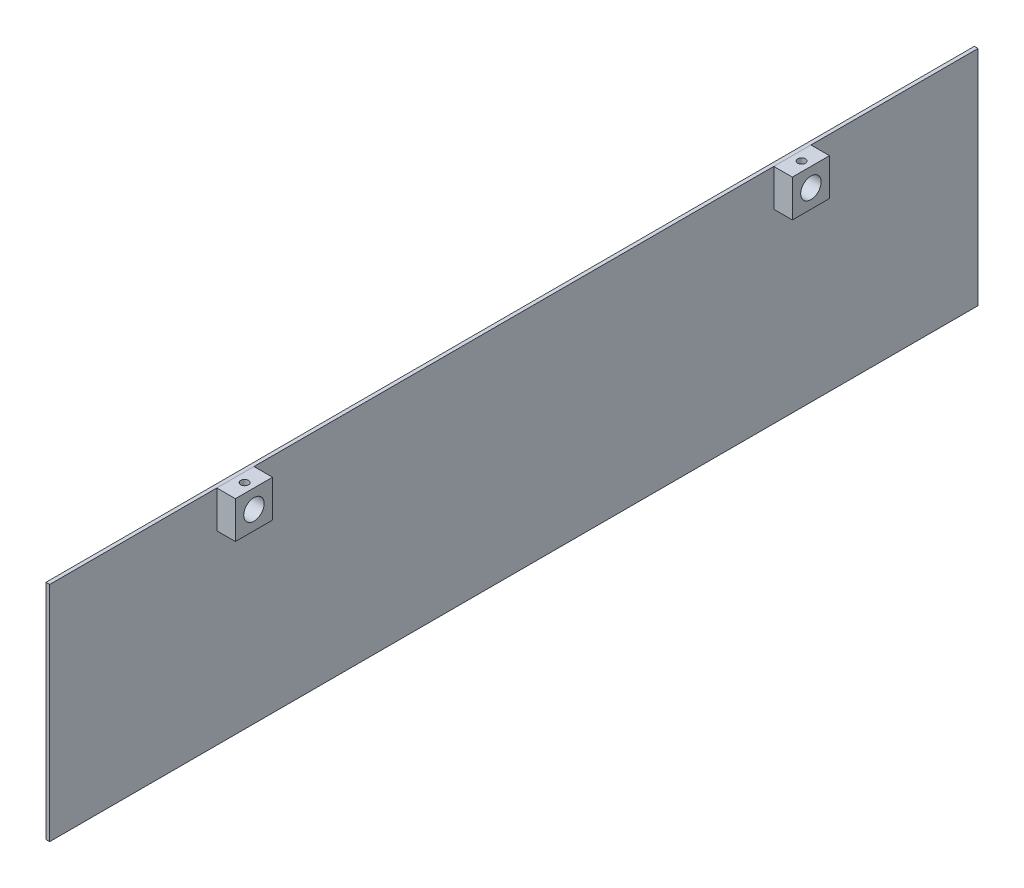
ISO-10303-21;
HEADER;
FILE_DESCRIPTION(('STEP AP214'),'2;1');
FILE_NAME('part.step','',(''),(''),'','','');
FILE_SCHEMA(('AUTOMOTIVE_DESIGN { 1 0 10303 214 1 1 1 1 }'));
ENDSEC;
DATA;
#1=APPLICATION_CONTEXT('core data for automotive mechanical design processes');
#2=APPLICATION_PROTOCOL_DEFINITION('international standard','automotive_design',2000,#1);
#3=PRODUCT_CONTEXT('',#1,'mechanical');
#4=PRODUCT('Part','Part','',(#3));
#5=PRODUCT_RELATED_PRODUCT_CATEGORY('part','',(#4));
#6=PRODUCT_DEFINITION_FORMATION('','',#4);
#7=PRODUCT_DEFINITION_CONTEXT('part definition',#1,'design');
#8=PRODUCT_DEFINITION('design','',#6,#7);
#9=PRODUCT_DEFINITION_SHAPE('','',#8);
#10=(LENGTH_UNIT() NAMED_UNIT(*) SI_UNIT(.MILLI.,.METRE.));
#11=(NAMED_UNIT(*) PLANE_ANGLE_UNIT() SI_UNIT($,.RADIAN.));
#12=(NAMED_UNIT(*) SI_UNIT($,.STERADIAN.) SOLID_ANGLE_UNIT());
#13=UNCERTAINTY_MEASURE_WITH_UNIT(LENGTH_MEASURE(1.E-05),#10,'distance_accuracy_value','');
#14=(GEOMETRIC_REPRESENTATION_CONTEXT(3) GLOBAL_UNCERTAINTY_ASSIGNED_CONTEXT((#13)) GLOBAL_UNIT_ASSIGNED_CONTEXT((#10,
#11,#12)) REPRESENTATION_CONTEXT('',''));
#15=CARTESIAN_POINT('',(0.,0.,0.));
#16=DIRECTION('',(0.,0.,1.));
#17=DIRECTION('',(1.,0.,0.));
#18=AXIS2_PLACEMENT_3D('',#15,#16,#17);
#19=CARTESIAN_POINT('',(12.,120.,-140.));
#20=DIRECTION('',(0.,0.,-1.));
#21=DIRECTION('',(-1.,0.,0.));
#22=AXIS2_PLACEMENT_3D('',#19,#20,#21);
#23=PLANE('',#22);
#24=DIRECTION('',(0.,-1.,0.));
#25=VECTOR('',#24,1.);
#26=CARTESIAN_POINT('',(2.,120.,-140.));
#27=LINE('',#26,#25);
#28=CARTESIAN_POINT('',(2.,120.,-140.));
#29=VERTEX_POINT('',#28);
#30=CARTESIAN_POINT('',(2.,100.,-140.));
#31=VERTEX_POINT('',#30);
#32=EDGE_CURVE('E127',#29,#31,#27,.T.);
#33=ORIENTED_EDGE('',*,*,#32,.T.);
#34=DIRECTION('',(-1.,0.,0.));
#35=VECTOR('',#34,1.);
#36=CARTESIAN_POINT('',(12.,100.,-140.));
#37=LINE('',#36,#35);
#38=CARTESIAN_POINT('',(12.,100.,-140.));
#39=VERTEX_POINT('',#38);
#40=EDGE_CURVE('E12',#39,#31,#37,.T.);
#41=ORIENTED_EDGE('',*,*,#40,.F.);
#42=DIRECTION('',(0.,-1.,0.));
#43=VECTOR('',#42,1.);
#44=CARTESIAN_POINT('',(12.,120.,-140.));
#45=LINE('',#44,#43);
#46=CARTESIAN_POINT('',(12.,120.,-140.));
#47=VERTEX_POINT('',#46);
#48=EDGE_CURVE('E114',#47,#39,#45,.T.);
#49=ORIENTED_EDGE('',*,*,#48,.F.);
#50=DIRECTION('',(-1.,0.,0.));
#51=VECTOR('',#50,1.);
#52=CARTESIAN_POINT('',(12.,120.,-140.));
#53=LINE('',#52,#51);
#54=EDGE_CURVE('E123',#47,#29,#53,.T.);
#55=ORIENTED_EDGE('',*,*,#54,.T.);
#56=EDGE_LOOP('',(#33,#41,#49,#55));
#57=FACE_BOUND('',#56,.T.);
#58=ADVANCED_FACE('F57',(#57),#23,.F.);
#59=CARTESIAN_POINT('',(12.,100.,-140.));
#60=DIRECTION('',(0.,1.,0.));
#61=DIRECTION('',(0.,0.,1.));
#62=AXIS2_PLACEMENT_3D('',#59,#60,#61);
#63=PLANE('',#62);
#64=DIRECTION('',(0.,0.,-1.));
#65=VECTOR('',#64,1.);
#66=CARTESIAN_POINT('',(2.,100.,-140.));
#67=LINE('',#66,#65);
#68=CARTESIAN_POINT('',(2.,100.,-160.));
#69=VERTEX_POINT('',#68);
#70=EDGE_CURVE('E118',#31,#69,#67,.T.);
#71=ORIENTED_EDGE('',*,*,#70,.T.);
#72=DIRECTION('',(-1.,0.,0.));
#73=VECTOR('',#72,1.);
#74=CARTESIAN_POINT('',(12.,100.,-160.));
#75=LINE('',#74,#73);
#76=CARTESIAN_POINT('',(12.,100.,-160.));
#77=VERTEX_POINT('',#76);
#78=EDGE_CURVE('E70',#77,#69,#75,.T.);
#79=ORIENTED_EDGE('',*,*,#78,.F.);
#80=DIRECTION('',(0.,0.,-1.));
#81=VECTOR('',#80,1.);
#82=CARTESIAN_POINT('',(12.,100.,-140.));
#83=LINE('',#82,#81);
#84=EDGE_CURVE('E109',#39,#77,#83,.T.);
#85=ORIENTED_EDGE('',*,*,#84,.F.);
#86=ORIENTED_EDGE('',*,*,#40,.T.);
#87=EDGE_LOOP('',(#71,#79,#85,#86));
#88=FACE_BOUND('',#87,.T.);
#89=ADVANCED_FACE('F117',(#88),#63,.F.);
#90=CARTESIAN_POINT('',(12.,120.,-160.));
#91=DIRECTION('',(0.,0.,1.));
#92=DIRECTION('',(0.,-1.,0.));
#93=AXIS2_PLACEMENT_3D('',#90,#91,#92);
#94=PLANE('',#93);
#95=DIRECTION('',(0.,1.,0.));
#96=VECTOR('',#95,1.);
#97=CARTESIAN_POINT('',(2.,120.,-160.));
#98=LINE('',#97,#96);
#99=CARTESIAN_POINT('',(2.,120.,-160.));
#100=VERTEX_POINT('',#99);
#101=EDGE_CURVE('E96',#69,#100,#98,.T.);
#102=ORIENTED_EDGE('',*,*,#101,.T.);
#103=DIRECTION('',(-1.,0.,0.));
#104=VECTOR('',#103,1.);
#105=CARTESIAN_POINT('',(12.,120.,-160.));
#106=LINE('',#105,#104);
#107=CARTESIAN_POINT('',(12.,120.,-160.));
#108=VERTEX_POINT('',#107);
#109=EDGE_CURVE('E119',#108,#100,#106,.T.);
#110=ORIENTED_EDGE('',*,*,#109,.F.);
#111=DIRECTION('',(0.,1.,0.));
#112=VECTOR('',#111,1.);
#113=CARTESIAN_POINT('',(12.,120.,-160.));
#114=LINE('',#113,#112);
#115=EDGE_CURVE('E112',#77,#108,#114,.T.);
#116=ORIENTED_EDGE('',*,*,#115,.F.);
#117=ORIENTED_EDGE('',*,*,#78,.T.);
#118=EDGE_LOOP('',(#102,#110,#116,#117));
#119=FACE_BOUND('',#118,.T.);
#120=ADVANCED_FACE('F121',(#119),#94,.F.);
#121=CARTESIAN_POINT('',(12.,120.,-140.));
#122=DIRECTION('',(0.,-1.,0.));
#123=DIRECTION('',(0.,0.,-1.));
#124=AXIS2_PLACEMENT_3D('',#121,#122,#123);
#125=PLANE('',#124);
#126=CARTESIAN_POINT('',(7.,120.,-150.));
#127=DIRECTION('',(0.,1.,0.));
#128=DIRECTION('',(0.,0.,1.));
#129=AXIS2_PLACEMENT_3D('',#126,#127,#128);
#130=CIRCLE('',#129,2.1);
#131=CARTESIAN_POINT('',(7.,120.,-147.9));
#132=VERTEX_POINT('',#131);
#133=EDGE_CURVE('E142',#132,#132,#130,.T.);
#134=ORIENTED_EDGE('',*,*,#133,.F.);
#135=EDGE_LOOP('',(#134));
#136=FACE_BOUND('',#135,.T.);
#137=DIRECTION('',(0.,0.,1.));
#138=VECTOR('',#137,1.);
#139=CARTESIAN_POINT('',(2.,120.,-140.));
#140=LINE('',#139,#138);
#141=EDGE_CURVE('E102',#100,#29,#140,.T.);
#142=ORIENTED_EDGE('',*,*,#141,.T.);
#143=ORIENTED_EDGE('',*,*,#54,.F.);
#144=DIRECTION('',(0.,0.,1.));
#145=VECTOR('',#144,1.);
#146=CARTESIAN_POINT('',(12.,120.,-140.));
#147=LINE('',#146,#145);
#148=EDGE_CURVE('E79',#108,#47,#147,.T.);
#149=ORIENTED_EDGE('',*,*,#148,.F.);
#150=ORIENTED_EDGE('',*,*,#109,.T.);
#151=EDGE_LOOP('',(#142,#143,#149,#150));
#152=FACE_BOUND('',#151,.T.);
#153=ADVANCED_FACE('F152',(#136,#152),#125,.F.);
#154=CARTESIAN_POINT('',(12.,0.,0.));
#155=DIRECTION('',(1.,0.,0.));
#156=DIRECTION('',(0.,0.,-1.));
#157=AXIS2_PLACEMENT_3D('',#154,#155,#156);
#158=PLANE('',#157);
#159=CARTESIAN_POINT('',(12.,110.,-150.));
#160=DIRECTION('',(1.,0.,0.));
#161=DIRECTION('',(0.,0.,-1.));
#162=AXIS2_PLACEMENT_3D('',#159,#160,#161);
#163=CIRCLE('',#162,5.5);
#164=CARTESIAN_POINT('',(12.,110.,-155.5));
#165=VERTEX_POINT('',#164);
#166=EDGE_CURVE('E130',#165,#165,#163,.T.);
#167=ORIENTED_EDGE('',*,*,#166,.F.);
#168=EDGE_LOOP('',(#167));
#169=FACE_BOUND('',#168,.T.);
#170=ORIENTED_EDGE('',*,*,#48,.T.);
#171=ORIENTED_EDGE('',*,*,#84,.T.);
#172=ORIENTED_EDGE('',*,*,#115,.T.);
#173=ORIENTED_EDGE('',*,*,#148,.T.);
#174=EDGE_LOOP('',(#170,#171,#172,#173));
#175=FACE_BOUND('',#174,.T.);
#176=ADVANCED_FACE('F110',(#169,#175),#158,.T.);
#177=CARTESIAN_POINT('',(2.,0.,0.));
#178=DIRECTION('',(1.,0.,0.));
#179=DIRECTION('',(0.,0.,-1.));
#180=AXIS2_PLACEMENT_3D('',#177,#178,#179);
#181=PLANE('',#180);
#182=CARTESIAN_POINT('',(2.,110.,-150.));
#183=DIRECTION('',(1.,0.,0.));
#184=DIRECTION('',(0.,0.,-1.));
#185=AXIS2_PLACEMENT_3D('',#182,#183,#184);
#186=CIRCLE('',#185,5.5);
#187=CARTESIAN_POINT('',(2.,110.,-155.5));
#188=VERTEX_POINT('',#187);
#189=EDGE_CURVE('E135',#188,#188,#186,.T.);
#190=ORIENTED_EDGE('',*,*,#189,.T.);
#191=EDGE_LOOP('',(#190));
#192=FACE_BOUND('',#191,.T.);
#193=ORIENTED_EDGE('',*,*,#32,.F.);
#194=ORIENTED_EDGE('',*,*,#141,.F.);
#195=ORIENTED_EDGE('',*,*,#101,.F.);
#196=ORIENTED_EDGE('',*,*,#70,.F.);
#197=EDGE_LOOP('',(#193,#194,#195,#196));
#198=FACE_BOUND('',#197,.T.);
#199=ADVANCED_FACE('F159',(#192,#198),#181,.F.);
#200=CARTESIAN_POINT('',(0.,110.,-150.));
#201=DIRECTION('',(-1.,0.,0.));
#202=DIRECTION('',(0.,0.,1.));
#203=AXIS2_PLACEMENT_3D('',#200,#201,#202);
#204=CYLINDRICAL_SURFACE('',#203,5.5);
#205=CARTESIAN_POINT('',(7.,115.083306010856,-147.9));
#206=CARTESIAN_POINT('',(7.11323924599918,115.083301214416,-147.899994963913));
#207=CARTESIAN_POINT('',(7.22644605213108,115.087130898249,-147.909189696473));
#208=CARTESIAN_POINT('',(7.44943658790395,115.101922901937,-147.945550039406));
#209=CARTESIAN_POINT('',(7.55922051538683,115.112884808746,-147.9727146091));
#210=CARTESIAN_POINT('',(7.77207893179357,115.140522346164,-148.043864523318));
#211=CARTESIAN_POINT('',(7.87516929596382,115.157183822516,-148.087808229811));
#212=CARTESIAN_POINT('',(8.07255518360995,115.194319963944,-148.191120774258));
#213=CARTESIAN_POINT('',(8.16684795283485,115.214795817211,-148.250494420967));
#214=CARTESIAN_POINT('',(8.34882472708949,115.258436332225,-148.386260425491));
#215=CARTESIAN_POINT('',(8.43599136604027,115.281682060583,-148.463320367709));
#216=CARTESIAN_POINT('',(8.59653100997823,115.327568240787,-148.630856506143));
#217=CARTESIAN_POINT('',(8.6699009319702,115.350208556382,-148.721335692945));
#218=CARTESIAN_POINT('',(8.80328257446287,115.393301030513,-148.917094322527));
#219=CARTESIAN_POINT('',(8.86272835792435,115.413647129005,-149.022784812363));
#220=CARTESIAN_POINT('',(8.96277975012171,115.44888076722,-149.243580933959));
#221=CARTESIAN_POINT('',(9.00339215188897,115.463770274681,-149.358683153342));
#222=CARTESIAN_POINT('',(9.06279869448369,115.485837321835,-149.58959372244));
#223=CARTESIAN_POINT('',(9.08248432648559,115.493328910443,-149.70514211546));
#224=CARTESIAN_POINT('',(9.10233879614522,115.500885230288,-149.938129080697));
#225=CARTESIAN_POINT('',(9.10251421313418,115.500952465202,-150.055567002356));
#226=CARTESIAN_POINT('',(9.08385428477466,115.493849943725,-150.282595169799));
#227=CARTESIAN_POINT('',(9.06599295987754,115.487050974919,-150.392279111296));
#228=CARTESIAN_POINT('',(9.01340990239304,115.467469905258,-150.606956740662));
#229=CARTESIAN_POINT('',(8.97868697134,115.454687379112,-150.711950094561));
#230=CARTESIAN_POINT('',(8.89293296293302,115.424165535434,-150.916104523423));
#231=CARTESIAN_POINT('',(8.84166934367598,115.406356020723,-151.015156991787));
#232=CARTESIAN_POINT('',(8.72449800700278,115.367573140765,-151.203502611));
#233=CARTESIAN_POINT('',(8.65858547470169,115.346598735995,-151.292792538613));
#234=CARTESIAN_POINT('',(8.50933386494868,115.302142796285,-151.464802690471));
#235=CARTESIAN_POINT('',(8.42518228152462,115.278586349834,-151.546799622912));
#236=CARTESIAN_POINT('',(8.24419413020365,115.232625304142,-151.69579649357));
#237=CARTESIAN_POINT('',(8.14735414266442,115.210221017693,-151.762792375632));
#238=CARTESIAN_POINT('',(7.94078351559792,115.168618719592,-151.881338321953));
#239=CARTESIAN_POINT('',(7.83080138896254,115.149509472714,-151.932483852695));
#240=CARTESIAN_POINT('',(7.60286263095197,115.117690363236,-152.015250624193));
#241=CARTESIAN_POINT('',(7.4849106777992,115.104976782818,-152.046883210298));
#242=CARTESIAN_POINT('',(7.2515480532962,115.088272204495,-152.088050444268));
#243=CARTESIAN_POINT('',(7.13637365549402,115.083826729326,-152.098738332001));
#244=CARTESIAN_POINT('',(6.90581649510366,115.082872833562,-152.101049757352));
#245=CARTESIAN_POINT('',(6.79043379538704,115.086362322728,-152.092678315604));
#246=CARTESIAN_POINT('',(6.56877806112669,115.100422278701,-152.05815560956));
#247=CARTESIAN_POINT('',(6.46233782787644,115.110630501482,-152.032912940549));
#248=CARTESIAN_POINT('',(6.25525796839143,115.136542794095,-151.966516951426));
#249=CARTESIAN_POINT('',(6.154619561944,115.152248014754,-151.925360299443));
#250=CARTESIAN_POINT('',(5.957703840292,115.188124733232,-151.826531819896));
#251=CARTESIAN_POINT('',(5.86174188841835,115.20844444292,-151.768287050022));
#252=CARTESIAN_POINT('',(5.68054562227894,115.251017812303,-151.637538742146));
#253=CARTESIAN_POINT('',(5.59531537706469,115.27327220018,-151.565029822267));
#254=CARTESIAN_POINT('',(5.43215020452321,115.318986043928,-151.402139349036));
#255=CARTESIAN_POINT('',(5.35507081079171,115.34242783418,-151.310892808975));
#256=CARTESIAN_POINT('',(5.21720747685611,115.38647127696,-151.116188537561));
#257=CARTESIAN_POINT('',(5.15642373793007,115.407072894405,-151.012730655402));
#258=CARTESIAN_POINT('',(5.05323583817392,115.443119756007,-150.796501119386));
#259=CARTESIAN_POINT('',(5.01078265537107,115.45857872753,-150.683755279548));
#260=CARTESIAN_POINT('',(4.94569506813486,115.482631096604,-150.451994523788));
#261=CARTESIAN_POINT('',(4.92305096403179,115.49122785411,-150.33298270635));
#262=CARTESIAN_POINT('',(4.89929867972616,115.500258003107,-150.099786932427));
#263=CARTESIAN_POINT('',(4.89697663886882,115.50115147004,-149.985743370233));
#264=CARTESIAN_POINT('',(4.91078978317764,115.495885511465,-149.758957532749));
#265=CARTESIAN_POINT('',(4.92692260212128,115.489726990141,-149.646215092506));
#266=CARTESIAN_POINT('',(4.97633015625743,115.471264623559,-149.428220066486));
#267=CARTESIAN_POINT('',(5.00914781709263,115.459124892033,-149.322848915137));
#268=CARTESIAN_POINT('',(5.09053185625519,115.429975100761,-149.119107005863));
#269=CARTESIAN_POINT('',(5.13910121739089,115.412964118645,-149.020737578118));
#270=CARTESIAN_POINT('',(5.25296397987995,115.374861839354,-148.829186079211));
#271=CARTESIAN_POINT('',(5.31888300551865,115.353627315351,-148.736404933105));
#272=CARTESIAN_POINT('',(5.46459990279232,115.309673402757,-148.562851131284));
#273=CARTESIAN_POINT('',(5.54440279732914,115.286953478642,-148.482082841258));
#274=CARTESIAN_POINT('',(5.72085289950583,115.241047613535,-148.330251565274));
#275=CARTESIAN_POINT('',(5.81818662582507,115.217905145217,-148.259970127119));
#276=CARTESIAN_POINT('',(6.02401025807751,115.175174970982,-148.13671393994));
#277=CARTESIAN_POINT('',(6.13250212204522,115.15558789064,-148.083742235271));
#278=CARTESIAN_POINT('',(6.36457399080009,115.121510010511,-147.994361592728));
#279=CARTESIAN_POINT('',(6.48866796593674,115.107392862766,-147.95912899804));
#280=CARTESIAN_POINT('',(6.74185782249741,115.088296936256,-147.911959586557));
#281=CARTESIAN_POINT('',(6.87094997672628,115.083311476987,-147.900005739239));
#282=CARTESIAN_POINT('',(7.,115.083306010856,-147.9));
#283=B_SPLINE_CURVE_WITH_KNOTS('',3,(#205,#206,#207,#208,#209,#210,#211,#212,#213,#214,#215,
#216,#217,#218,#219,#220,#221,#222,#223,#224,#225,#226,#227,#228,#229,#230,#231,#232,#233,#234,
#235,#236,#237,#238,#239,#240,#241,#242,#243,#244,#245,#246,#247,#248,#249,#250,#251,#252,#253,
#254,#255,#256,#257,#258,#259,#260,#261,#262,#263,#264,#265,#266,#267,#268,#269,#270,#271,#272,
#273,#274,#275,#276,#277,#278,#279,#280,#281,#282),.UNSPECIFIED.,.T.,.F.,(4,2,2,2,2,2,2,2,2,2,2,
2,2,2,2,2,2,2,2,2,2,2,2,2,2,2,2,2,2,2,2,2,2,2,2,2,2,2,4),(0.,0.339236745329205,
0.678453846334541,1.01683458183301,1.35532090073262,1.70968239708651,2.06412298471311,
2.43113201692697,2.79800856912394,3.14853893275951,3.49895108845312,3.83140130712534,
4.16387515868885,4.50124323629779,4.83872236632005,5.19659957847019,5.55457344100136,
5.92104736634925,6.28730801259865,6.63276245548056,6.97812590884218,7.30624576014903,
7.63443434630403,7.97521179849022,8.31611807380053,8.67957522382824,9.04303686294126,
9.40552037257612,9.76782628982698,10.1083317692312,10.4487935950156,10.7803943485643,
11.1120579321294,11.457885233258,11.8038379088439,12.1688817993161,12.5339898574897,
12.9208749252753,13.3074768448991),.UNSPECIFIED.);
#284=CARTESIAN_POINT('',(7.,115.083306010856,-147.9));
#285=VERTEX_POINT('',#284);
#286=EDGE_CURVE('E60',#285,#285,#283,.T.);
#287=ORIENTED_EDGE('',*,*,#286,.T.);
#288=EDGE_LOOP('',(#287));
#289=FACE_BOUND('',#288,.T.);
#290=ORIENTED_EDGE('',*,*,#166,.T.);
#291=EDGE_LOOP('',(#290));
#292=FACE_BOUND('',#291,.T.);
#293=ORIENTED_EDGE('',*,*,#189,.F.);
#294=EDGE_LOOP('',(#293));
#295=FACE_BOUND('',#294,.T.);
#296=ADVANCED_FACE('F172',(#289,#292,#295),#204,.F.);
#297=CARTESIAN_POINT('',(7.,120.,-150.));
#298=DIRECTION('',(0.,1.,0.));
#299=DIRECTION('',(0.,0.,1.));
#300=AXIS2_PLACEMENT_3D('',#297,#298,#299);
#301=CYLINDRICAL_SURFACE('',#300,2.1);
#302=ORIENTED_EDGE('',*,*,#133,.T.);
#303=EDGE_LOOP('',(#302));
#304=FACE_BOUND('',#303,.T.);
#305=ORIENTED_EDGE('',*,*,#286,.F.);
#306=EDGE_LOOP('',(#305));
#307=FACE_BOUND('',#306,.T.);
#308=ADVANCED_FACE('F149',(#304,#307),#301,.F.);
#309=CLOSED_SHELL('',(#58,#89,#120,#153,#176,#199,#296,#308));
#310=MANIFOLD_SOLID_BREP('B2',#309);
#311=CARTESIAN_POINT('',(12.,120.,160.));
#312=DIRECTION('',(0.,0.,-1.));
#313=DIRECTION('',(-1.,0.,0.));
#314=AXIS2_PLACEMENT_3D('',#311,#312,#313);
#315=PLANE('',#314);
#316=DIRECTION('',(0.,-1.,0.));
#317=VECTOR('',#316,1.);
#318=CARTESIAN_POINT('',(2.,120.,160.));
#319=LINE('',#318,#317);
#320=CARTESIAN_POINT('',(2.,120.,160.));
#321=VERTEX_POINT('',#320);
#322=CARTESIAN_POINT('',(2.,100.,160.));
#323=VERTEX_POINT('',#322);
#324=EDGE_CURVE('E322',#321,#323,#319,.T.);
#325=ORIENTED_EDGE('',*,*,#324,.T.);
#326=DIRECTION('',(-1.,0.,0.));
#327=VECTOR('',#326,1.);
#328=CARTESIAN_POINT('',(12.,100.,160.));
#329=LINE('',#328,#327);
#330=CARTESIAN_POINT('',(12.,100.,160.));
#331=VERTEX_POINT('',#330);
#332=EDGE_CURVE('E55',#331,#323,#329,.T.);
#333=ORIENTED_EDGE('',*,*,#332,.F.);
#334=DIRECTION('',(0.,-1.,0.));
#335=VECTOR('',#334,1.);
#336=CARTESIAN_POINT('',(12.,120.,160.));
#337=LINE('',#336,#335);
#338=CARTESIAN_POINT('',(12.,120.,160.));
#339=VERTEX_POINT('',#338);
#340=EDGE_CURVE('E309',#339,#331,#337,.T.);
#341=ORIENTED_EDGE('',*,*,#340,.F.);
#342=DIRECTION('',(-1.,0.,0.));
#343=VECTOR('',#342,1.);
#344=CARTESIAN_POINT('',(12.,120.,160.));
#345=LINE('',#344,#343);
#346=EDGE_CURVE('E318',#339,#321,#345,.T.);
#347=ORIENTED_EDGE('',*,*,#346,.T.);
#348=EDGE_LOOP('',(#325,#333,#341,#347));
#349=FACE_BOUND('',#348,.T.);
#350=ADVANCED_FACE('F252',(#349),#315,.F.);
#351=CARTESIAN_POINT('',(12.,100.,160.));
#352=DIRECTION('',(0.,1.,0.));
#353=DIRECTION('',(0.,0.,1.));
#354=AXIS2_PLACEMENT_3D('',#351,#352,#353);
#355=PLANE('',#354);
#356=DIRECTION('',(0.,0.,-1.));
#357=VECTOR('',#356,1.);
#358=CARTESIAN_POINT('',(2.,100.,160.));
#359=LINE('',#358,#357);
#360=CARTESIAN_POINT('',(2.,100.,140.));
#361=VERTEX_POINT('',#360);
#362=EDGE_CURVE('E313',#323,#361,#359,.T.);
#363=ORIENTED_EDGE('',*,*,#362,.T.);
#364=DIRECTION('',(-1.,0.,0.));
#365=VECTOR('',#364,1.);
#366=CARTESIAN_POINT('',(12.,100.,140.));
#367=LINE('',#366,#365);
#368=CARTESIAN_POINT('',(12.,100.,140.));
#369=VERTEX_POINT('',#368);
#370=EDGE_CURVE('E265',#369,#361,#367,.T.);
#371=ORIENTED_EDGE('',*,*,#370,.F.);
#372=DIRECTION('',(0.,0.,-1.));
#373=VECTOR('',#372,1.);
#374=CARTESIAN_POINT('',(12.,100.,160.));
#375=LINE('',#374,#373);
#376=EDGE_CURVE('E304',#331,#369,#375,.T.);
#377=ORIENTED_EDGE('',*,*,#376,.F.);
#378=ORIENTED_EDGE('',*,*,#332,.T.);
#379=EDGE_LOOP('',(#363,#371,#377,#378));
#380=FACE_BOUND('',#379,.T.);
#381=ADVANCED_FACE('F312',(#380),#355,.F.);
#382=CARTESIAN_POINT('',(12.,120.,140.));
#383=DIRECTION('',(0.,0.,1.));
#384=DIRECTION('',(1.,0.,0.));
#385=AXIS2_PLACEMENT_3D('',#382,#383,#384);
#386=PLANE('',#385);
#387=DIRECTION('',(0.,1.,0.));
#388=VECTOR('',#387,1.);
#389=CARTESIAN_POINT('',(2.,120.,140.));
#390=LINE('',#389,#388);
#391=CARTESIAN_POINT('',(2.,120.,140.));
#392=VERTEX_POINT('',#391);
#393=EDGE_CURVE('E291',#361,#392,#390,.T.);
#394=ORIENTED_EDGE('',*,*,#393,.T.);
#395=DIRECTION('',(-1.,0.,0.));
#396=VECTOR('',#395,1.);
#397=CARTESIAN_POINT('',(12.,120.,140.));
#398=LINE('',#397,#396);
#399=CARTESIAN_POINT('',(12.,120.,140.));
#400=VERTEX_POINT('',#399);
#401=EDGE_CURVE('E314',#400,#392,#398,.T.);
#402=ORIENTED_EDGE('',*,*,#401,.F.);
#403=DIRECTION('',(0.,1.,0.));
#404=VECTOR('',#403,1.);
#405=CARTESIAN_POINT('',(12.,120.,140.));
#406=LINE('',#405,#404);
#407=EDGE_CURVE('E307',#369,#400,#406,.T.);
#408=ORIENTED_EDGE('',*,*,#407,.F.);
#409=ORIENTED_EDGE('',*,*,#370,.T.);
#410=EDGE_LOOP('',(#394,#402,#408,#409));
#411=FACE_BOUND('',#410,.T.);
#412=ADVANCED_FACE('F316',(#411),#386,.F.);
#413=CARTESIAN_POINT('',(12.,120.,160.));
#414=DIRECTION('',(0.,-1.,0.));
#415=DIRECTION('',(0.,0.,-1.));
#416=AXIS2_PLACEMENT_3D('',#413,#414,#415);
#417=PLANE('',#416);
#418=CARTESIAN_POINT('',(7.,120.,150.));
#419=DIRECTION('',(0.,1.,0.));
#420=DIRECTION('',(0.,0.,1.));
#421=AXIS2_PLACEMENT_3D('',#418,#419,#420);
#422=CIRCLE('',#421,2.1);
#423=CARTESIAN_POINT('',(7.,120.,152.1));
#424=VERTEX_POINT('',#423);
#425=EDGE_CURVE('E337',#424,#424,#422,.T.);
#426=ORIENTED_EDGE('',*,*,#425,.F.);
#427=EDGE_LOOP('',(#426));
#428=FACE_BOUND('',#427,.T.);
#429=DIRECTION('',(0.,0.,1.));
#430=VECTOR('',#429,1.);
#431=CARTESIAN_POINT('',(2.,120.,160.));
#432=LINE('',#431,#430);
#433=EDGE_CURVE('E297',#392,#321,#432,.T.);
#434=ORIENTED_EDGE('',*,*,#433,.T.);
#435=ORIENTED_EDGE('',*,*,#346,.F.);
#436=DIRECTION('',(0.,0.,1.));
#437=VECTOR('',#436,1.);
#438=CARTESIAN_POINT('',(12.,120.,160.));
#439=LINE('',#438,#437);
#440=EDGE_CURVE('E274',#400,#339,#439,.T.);
#441=ORIENTED_EDGE('',*,*,#440,.F.);
#442=ORIENTED_EDGE('',*,*,#401,.T.);
#443=EDGE_LOOP('',(#434,#435,#441,#442));
#444=FACE_BOUND('',#443,.T.);
#445=ADVANCED_FACE('F347',(#428,#444),#417,.F.);
#446=CARTESIAN_POINT('',(12.,0.,0.));
#447=DIRECTION('',(1.,0.,0.));
#448=DIRECTION('',(0.,0.,-1.));
#449=AXIS2_PLACEMENT_3D('',#446,#447,#448);
#450=PLANE('',#449);
#451=CARTESIAN_POINT('',(12.,110.,150.));
#452=DIRECTION('',(1.,0.,0.));
#453=DIRECTION('',(0.,0.,-1.));
#454=AXIS2_PLACEMENT_3D('',#451,#452,#453);
#455=CIRCLE('',#454,5.5);
#456=CARTESIAN_POINT('',(12.,110.,144.5));
#457=VERTEX_POINT('',#456);
#458=EDGE_CURVE('E325',#457,#457,#455,.T.);
#459=ORIENTED_EDGE('',*,*,#458,.F.);
#460=EDGE_LOOP('',(#459));
#461=FACE_BOUND('',#460,.T.);
#462=ORIENTED_EDGE('',*,*,#340,.T.);
#463=ORIENTED_EDGE('',*,*,#376,.T.);
#464=ORIENTED_EDGE('',*,*,#407,.T.);
#465=ORIENTED_EDGE('',*,*,#440,.T.);
#466=EDGE_LOOP('',(#462,#463,#464,#465));
#467=FACE_BOUND('',#466,.T.);
#468=ADVANCED_FACE('F305',(#461,#467),#450,.T.);
#469=CARTESIAN_POINT('',(2.,0.,0.));
#470=DIRECTION('',(1.,0.,0.));
#471=DIRECTION('',(0.,0.,-1.));
#472=AXIS2_PLACEMENT_3D('',#469,#470,#471);
#473=PLANE('',#472);
#474=CARTESIAN_POINT('',(2.,110.,150.));
#475=DIRECTION('',(1.,0.,0.));
#476=DIRECTION('',(0.,0.,-1.));
#477=AXIS2_PLACEMENT_3D('',#474,#475,#476);
#478=CIRCLE('',#477,5.5);
#479=CARTESIAN_POINT('',(2.,110.,144.5));
#480=VERTEX_POINT('',#479);
#481=EDGE_CURVE('E330',#480,#480,#478,.T.);
#482=ORIENTED_EDGE('',*,*,#481,.T.);
#483=EDGE_LOOP('',(#482));
#484=FACE_BOUND('',#483,.T.);
#485=ORIENTED_EDGE('',*,*,#324,.F.);
#486=ORIENTED_EDGE('',*,*,#433,.F.);
#487=ORIENTED_EDGE('',*,*,#393,.F.);
#488=ORIENTED_EDGE('',*,*,#362,.F.);
#489=EDGE_LOOP('',(#485,#486,#487,#488));
#490=FACE_BOUND('',#489,.T.);
#491=ADVANCED_FACE('F354',(#484,#490),#473,.F.);
#492=CARTESIAN_POINT('',(0.,110.,150.));
#493=DIRECTION('',(-1.,0.,0.));
#494=DIRECTION('',(0.,0.,1.));
#495=AXIS2_PLACEMENT_3D('',#492,#493,#494);
#496=CYLINDRICAL_SURFACE('',#495,5.5);
#497=CARTESIAN_POINT('',(7.,115.083306010856,152.1));
#498=CARTESIAN_POINT('',(7.11323924599918,115.083301214416,152.100005036087));
#499=CARTESIAN_POINT('',(7.22644605213108,115.087130898249,152.090810303527));
#500=CARTESIAN_POINT('',(7.44943658790396,115.101922901937,152.054449960594));
#501=CARTESIAN_POINT('',(7.55922051538683,115.112884808746,152.0272853909));
#502=CARTESIAN_POINT('',(7.77207893179358,115.140522346164,151.956135476682));
#503=CARTESIAN_POINT('',(7.87516929596385,115.157183822516,151.912191770189));
#504=CARTESIAN_POINT('',(8.07255518360998,115.194319963944,151.808879225742));
#505=CARTESIAN_POINT('',(8.16684795283486,115.214795817211,151.749505579033));
#506=CARTESIAN_POINT('',(8.34882472708949,115.258436332225,151.613739574509));
#507=CARTESIAN_POINT('',(8.43599136604026,115.281682060583,151.536679632292));
#508=CARTESIAN_POINT('',(8.59653100997821,115.327568240787,151.369143493857));
#509=CARTESIAN_POINT('',(8.6699009319702,115.350208556382,151.278664307055));
#510=CARTESIAN_POINT('',(8.80328257446287,115.393301030513,151.082905677473));
#511=CARTESIAN_POINT('',(8.86272835792435,115.413647129005,150.977215187637));
#512=CARTESIAN_POINT('',(8.96277975012171,115.44888076722,150.756419066041));
#513=CARTESIAN_POINT('',(9.00339215188897,115.463770274681,150.641316846658));
#514=CARTESIAN_POINT('',(9.06279869448369,115.485837321835,150.41040627756));
#515=CARTESIAN_POINT('',(9.08248432648559,115.493328910443,150.29485788454));
#516=CARTESIAN_POINT('',(9.10233879614522,115.500885230288,150.061870919303));
#517=CARTESIAN_POINT('',(9.10251421313418,115.500952465202,149.944432997644));
#518=CARTESIAN_POINT('',(9.08385428477466,115.493849943725,149.717404830201));
#519=CARTESIAN_POINT('',(9.06599295987754,115.487050974919,149.607720888704));
#520=CARTESIAN_POINT('',(9.01340990239304,115.467469905258,149.393043259338));
#521=CARTESIAN_POINT('',(8.97868697134,115.454687379112,149.288049905439));
#522=CARTESIAN_POINT('',(8.89293296293302,115.424165535434,149.083895476577));
#523=CARTESIAN_POINT('',(8.84166934367598,115.406356020723,148.984843008213));
#524=CARTESIAN_POINT('',(8.72449800700278,115.367573140765,148.796497389));
#525=CARTESIAN_POINT('',(8.65858547470169,115.346598735995,148.707207461387));
#526=CARTESIAN_POINT('',(8.50933386494868,115.302142796285,148.535197309529));
#527=CARTESIAN_POINT('',(8.42518228152461,115.278586349834,148.453200377088));
#528=CARTESIAN_POINT('',(8.24419413020364,115.232625304142,148.30420350643));
#529=CARTESIAN_POINT('',(8.14735414266442,115.210221017693,148.237207624368));
#530=CARTESIAN_POINT('',(7.94078351559792,115.168618719592,148.118661678047));
#531=CARTESIAN_POINT('',(7.83080138896254,115.149509472714,148.067516147305));
#532=CARTESIAN_POINT('',(7.60286263095197,115.117690363236,147.984749375807));
#533=CARTESIAN_POINT('',(7.4849106777992,115.104976782818,147.953116789702));
#534=CARTESIAN_POINT('',(7.2515480532962,115.088272204495,147.911949555732));
#535=CARTESIAN_POINT('',(7.13637365549402,115.083826729326,147.901261667999));
#536=CARTESIAN_POINT('',(6.90581649510366,115.082872833562,147.898950242648));
#537=CARTESIAN_POINT('',(6.79043379538704,115.086362322728,147.907321684396));
#538=CARTESIAN_POINT('',(6.56877806112669,115.100422278701,147.94184439044));
#539=CARTESIAN_POINT('',(6.46233782787644,115.110630501482,147.967087059451));
#540=CARTESIAN_POINT('',(6.25525796839143,115.136542794095,148.033483048574));
#541=CARTESIAN_POINT('',(6.154619561944,115.152248014754,148.074639700557));
#542=CARTESIAN_POINT('',(5.957703840292,115.188124733232,148.173468180104));
#543=CARTESIAN_POINT('',(5.86174188841835,115.20844444292,148.231712949978));
#544=CARTESIAN_POINT('',(5.68054562227894,115.251017812303,148.362461257854));
#545=CARTESIAN_POINT('',(5.59531537706469,115.27327220018,148.434970177733));
#546=CARTESIAN_POINT('',(5.43215020452321,115.318986043928,148.597860650964));
#547=CARTESIAN_POINT('',(5.3550708107917,115.34242783418,148.689107191025));
#548=CARTESIAN_POINT('',(5.2172074768561,115.38647127696,148.883811462439));
#549=CARTESIAN_POINT('',(5.15642373793007,115.407072894405,148.987269344598));
#550=CARTESIAN_POINT('',(5.05323583817392,115.443119756007,149.203498880614));
#551=CARTESIAN_POINT('',(5.01078265537107,115.45857872753,149.316244720452));
#552=CARTESIAN_POINT('',(4.94569506813486,115.482631096604,149.548005476212));
#553=CARTESIAN_POINT('',(4.92305096403179,115.49122785411,149.66701729365));
#554=CARTESIAN_POINT('',(4.89929867972616,115.500258003107,149.900213067573));
#555=CARTESIAN_POINT('',(4.89697663886882,115.50115147004,150.014256629767));
#556=CARTESIAN_POINT('',(4.91078978317764,115.495885511465,150.241042467251));
#557=CARTESIAN_POINT('',(4.92692260212128,115.489726990141,150.353784907494));
#558=CARTESIAN_POINT('',(4.97633015625743,115.471264623559,150.571779933514));
#559=CARTESIAN_POINT('',(5.00914781709263,115.459124892033,150.677151084863));
#560=CARTESIAN_POINT('',(5.09053185625519,115.429975100761,150.880892994137));
#561=CARTESIAN_POINT('',(5.13910121739088,115.412964118645,150.979262421882));
#562=CARTESIAN_POINT('',(5.25296397987995,115.374861839354,151.170813920789));
#563=CARTESIAN_POINT('',(5.31888300551864,115.353627315351,151.263595066895));
#564=CARTESIAN_POINT('',(5.46459990279231,115.309673402757,151.437148868717));
#565=CARTESIAN_POINT('',(5.54440279732914,115.286953478642,151.517917158741));
#566=CARTESIAN_POINT('',(5.72085289950583,115.241047613535,151.669748434726));
#567=CARTESIAN_POINT('',(5.81818662582506,115.217905145217,151.740029872881));
#568=CARTESIAN_POINT('',(6.0240102580775,115.175174970982,151.86328606006));
#569=CARTESIAN_POINT('',(6.13250212204521,115.15558789064,151.916257764729));
#570=CARTESIAN_POINT('',(6.36457399080009,115.121510010511,152.005638407272));
#571=CARTESIAN_POINT('',(6.48866796593674,115.107392862766,152.04087100196));
#572=CARTESIAN_POINT('',(6.7418578224974,115.088296936256,152.088040413443));
#573=CARTESIAN_POINT('',(6.87094997672628,115.083311476987,152.099994260761));
#574=CARTESIAN_POINT('',(7.,115.083306010856,152.1));
#575=B_SPLINE_CURVE_WITH_KNOTS('',3,(#497,#498,#499,#500,#501,#502,#503,#504,#505,#506,#507,
#508,#509,#510,#511,#512,#513,#514,#515,#516,#517,#518,#519,#520,#521,#522,#523,#524,#525,#526,
#527,#528,#529,#530,#531,#532,#533,#534,#535,#536,#537,#538,#539,#540,#541,#542,#543,#544,#545,
#546,#547,#548,#549,#550,#551,#552,#553,#554,#555,#556,#557,#558,#559,#560,#561,#562,#563,#564,
#565,#566,#567,#568,#569,#570,#571,#572,#573,#574),.UNSPECIFIED.,.T.,.F.,(4,2,2,2,2,2,2,2,2,2,2,
2,2,2,2,2,2,2,2,2,2,2,2,2,2,2,2,2,2,2,2,2,2,2,2,2,2,2,4),(0.,0.339236745329209,
0.678453846334541,1.01683458183305,1.35532090073262,1.7096823970865,2.06412298471311,
2.43113201692697,2.79800856912394,3.14853893275948,3.49895108845312,3.83140130712534,
4.16387515868885,4.5012432362978,4.83872236632006,5.19659957847021,5.55457344100136,
5.92104736634925,6.28730801259865,6.63276245548056,6.97812590884218,7.30624576014903,
7.63443434630404,7.97521179849022,8.31611807380053,8.67957522382826,9.04303686294126,
9.40552037257614,9.76782628982698,10.1083317692312,10.4487935950156,10.7803943485643,
11.1120579321294,11.457885233258,11.8038379088439,12.1688817993161,12.5339898574897,
12.9208749252753,13.3074768448991),.UNSPECIFIED.);
#576=CARTESIAN_POINT('',(7.,115.083306010856,152.1));
#577=VERTEX_POINT('',#576);
#578=EDGE_CURVE('E255',#577,#577,#575,.T.);
#579=ORIENTED_EDGE('',*,*,#578,.T.);
#580=EDGE_LOOP('',(#579));
#581=FACE_BOUND('',#580,.T.);
#582=ORIENTED_EDGE('',*,*,#458,.T.);
#583=EDGE_LOOP('',(#582));
#584=FACE_BOUND('',#583,.T.);
#585=ORIENTED_EDGE('',*,*,#481,.F.);
#586=EDGE_LOOP('',(#585));
#587=FACE_BOUND('',#586,.T.);
#588=ADVANCED_FACE('F367',(#581,#584,#587),#496,.F.);
#589=CARTESIAN_POINT('',(7.,120.,150.));
#590=DIRECTION('',(0.,1.,0.));
#591=DIRECTION('',(0.,0.,1.));
#592=AXIS2_PLACEMENT_3D('',#589,#590,#591);
#593=CYLINDRICAL_SURFACE('',#592,2.1);
#594=ORIENTED_EDGE('',*,*,#425,.T.);
#595=EDGE_LOOP('',(#594));
#596=FACE_BOUND('',#595,.T.);
#597=ORIENTED_EDGE('',*,*,#578,.F.);
#598=EDGE_LOOP('',(#597));
#599=FACE_BOUND('',#598,.T.);
#600=ADVANCED_FACE('F344',(#596,#599),#593,.F.);
#601=CLOSED_SHELL('',(#350,#381,#412,#445,#468,#491,#588,#600));
#602=MANIFOLD_SOLID_BREP('B6',#601);
#603=CARTESIAN_POINT('',(2.,0.,-250.));
#604=DIRECTION('',(1.,0.,0.));
#605=DIRECTION('',(0.,0.,-1.));
#606=AXIS2_PLACEMENT_3D('',#603,#604,#605);
#607=PLANE('',#606);
#608=CARTESIAN_POINT('',(2.,110.,150.));
#609=DIRECTION('',(1.,0.,0.));
#610=DIRECTION('',(0.,0.,-1.));
#611=AXIS2_PLACEMENT_3D('',#608,#609,#610);
#612=CIRCLE('',#611,5.5);
#613=CARTESIAN_POINT('',(2.,110.,144.5));
#614=VERTEX_POINT('',#613);
#615=EDGE_CURVE('E524',#614,#614,#612,.T.);
#616=ORIENTED_EDGE('',*,*,#615,.F.);
#617=EDGE_LOOP('',(#616));
#618=FACE_BOUND('',#617,.T.);
#619=CARTESIAN_POINT('',(2.,110.,-150.));
#620=DIRECTION('',(1.,0.,0.));
#621=DIRECTION('',(0.,0.,-1.));
#622=AXIS2_PLACEMENT_3D('',#619,#620,#621);
#623=CIRCLE('',#622,5.5);
#624=CARTESIAN_POINT('',(2.,110.,-155.5));
#625=VERTEX_POINT('',#624);
#626=EDGE_CURVE('E508',#625,#625,#623,.T.);
#627=ORIENTED_EDGE('',*,*,#626,.F.);
#628=EDGE_LOOP('',(#627));
#629=FACE_BOUND('',#628,.T.);
#630=DIRECTION('',(0.,1.,0.));
#631=VECTOR('',#630,1.);
#632=CARTESIAN_POINT('',(2.,0.,250.));
#633=LINE('',#632,#631);
#634=CARTESIAN_POINT('',(2.,0.,250.));
#635=VERTEX_POINT('',#634);
#636=CARTESIAN_POINT('',(2.,120.,250.));
#637=VERTEX_POINT('',#636);
#638=EDGE_CURVE('E504',#635,#637,#633,.T.);
#639=ORIENTED_EDGE('',*,*,#638,.F.);
#640=DIRECTION('',(0.,0.,1.));
#641=VECTOR('',#640,1.);
#642=CARTESIAN_POINT('',(2.,0.,-250.));
#643=LINE('',#642,#641);
#644=CARTESIAN_POINT('',(2.,0.,-250.));
#645=VERTEX_POINT('',#644);
#646=EDGE_CURVE('E250',#645,#635,#643,.T.);
#647=ORIENTED_EDGE('',*,*,#646,.F.);
#648=DIRECTION('',(0.,1.,0.));
#649=VECTOR('',#648,1.);
#650=CARTESIAN_POINT('',(2.,0.,-250.));
#651=LINE('',#650,#649);
#652=CARTESIAN_POINT('',(2.,120.,-250.));
#653=VERTEX_POINT('',#652);
#654=EDGE_CURVE('E498',#645,#653,#651,.T.);
#655=ORIENTED_EDGE('',*,*,#654,.T.);
#656=DIRECTION('',(0.,0.,1.));
#657=VECTOR('',#656,1.);
#658=CARTESIAN_POINT('',(2.,120.,-250.));
#659=LINE('',#658,#657);
#660=EDGE_CURVE('E441',#653,#637,#659,.T.);
#661=ORIENTED_EDGE('',*,*,#660,.T.);
#662=EDGE_LOOP('',(#639,#647,#655,#661));
#663=FACE_BOUND('',#662,.T.);
#664=ADVANCED_FACE('F438',(#618,#629,#663),#607,.T.);
#665=CARTESIAN_POINT('',(2.,0.,-250.));
#666=DIRECTION('',(0.,1.,0.));
#667=DIRECTION('',(0.,0.,1.));
#668=AXIS2_PLACEMENT_3D('',#665,#666,#667);
#669=PLANE('',#668);
#670=DIRECTION('',(-1.,0.,0.));
#671=VECTOR('',#670,1.);
#672=CARTESIAN_POINT('',(2.,0.,250.));
#673=LINE('',#672,#671);
#674=CARTESIAN_POINT('',(0.,0.,250.));
#675=VERTEX_POINT('',#674);
#676=EDGE_CURVE('E471',#635,#675,#673,.T.);
#677=ORIENTED_EDGE('',*,*,#676,.T.);
#678=DIRECTION('',(0.,0.,1.));
#679=VECTOR('',#678,1.);
#680=CARTESIAN_POINT('',(0.,0.,-250.));
#681=LINE('',#680,#679);
#682=CARTESIAN_POINT('',(0.,0.,-250.));
#683=VERTEX_POINT('',#682);
#684=EDGE_CURVE('E447',#683,#675,#681,.T.);
#685=ORIENTED_EDGE('',*,*,#684,.F.);
#686=DIRECTION('',(-1.,0.,0.));
#687=VECTOR('',#686,1.);
#688=CARTESIAN_POINT('',(2.,0.,-250.));
#689=LINE('',#688,#687);
#690=EDGE_CURVE('E486',#645,#683,#689,.T.);
#691=ORIENTED_EDGE('',*,*,#690,.F.);
#692=ORIENTED_EDGE('',*,*,#646,.T.);
#693=EDGE_LOOP('',(#677,#685,#691,#692));
#694=FACE_BOUND('',#693,.T.);
#695=ADVANCED_FACE('F515',(#694),#669,.F.);
#696=CARTESIAN_POINT('',(0.,0.,-250.));
#697=DIRECTION('',(1.,0.,0.));
#698=DIRECTION('',(0.,0.,-1.));
#699=AXIS2_PLACEMENT_3D('',#696,#697,#698);
#700=PLANE('',#699);
#701=CARTESIAN_POINT('',(0.,110.,150.));
#702=DIRECTION('',(-1.,0.,0.));
#703=DIRECTION('',(0.,0.,1.));
#704=AXIS2_PLACEMENT_3D('',#701,#702,#703);
#705=CIRCLE('',#704,5.50000000000001);
#706=CARTESIAN_POINT('',(0.,110.,155.5));
#707=VERTEX_POINT('',#706);
#708=EDGE_CURVE('E533',#707,#707,#705,.T.);
#709=ORIENTED_EDGE('',*,*,#708,.F.);
#710=EDGE_LOOP('',(#709));
#711=FACE_BOUND('',#710,.T.);
#712=CARTESIAN_POINT('',(0.,110.,-150.));
#713=DIRECTION('',(-1.,0.,0.));
#714=DIRECTION('',(0.,0.,1.));
#715=AXIS2_PLACEMENT_3D('',#712,#713,#714);
#716=CIRCLE('',#715,5.50000000000001);
#717=CARTESIAN_POINT('',(0.,110.,-144.5));
#718=VERTEX_POINT('',#717);
#719=EDGE_CURVE('E528',#718,#718,#716,.T.);
#720=ORIENTED_EDGE('',*,*,#719,.F.);
#721=EDGE_LOOP('',(#720));
#722=FACE_BOUND('',#721,.T.);
#723=DIRECTION('',(0.,1.,0.));
#724=VECTOR('',#723,1.);
#725=CARTESIAN_POINT('',(0.,0.,250.));
#726=LINE('',#725,#724);
#727=CARTESIAN_POINT('',(0.,120.,250.));
#728=VERTEX_POINT('',#727);
#729=EDGE_CURVE('E493',#675,#728,#726,.T.);
#730=ORIENTED_EDGE('',*,*,#729,.T.);
#731=DIRECTION('',(0.,0.,1.));
#732=VECTOR('',#731,1.);
#733=CARTESIAN_POINT('',(0.,120.,-250.));
#734=LINE('',#733,#732);
#735=CARTESIAN_POINT('',(0.,120.,-250.));
#736=VERTEX_POINT('',#735);
#737=EDGE_CURVE('E490',#736,#728,#734,.T.);
#738=ORIENTED_EDGE('',*,*,#737,.F.);
#739=DIRECTION('',(0.,1.,0.));
#740=VECTOR('',#739,1.);
#741=CARTESIAN_POINT('',(0.,0.,-250.));
#742=LINE('',#741,#740);
#743=EDGE_CURVE('E483',#683,#736,#742,.T.);
#744=ORIENTED_EDGE('',*,*,#743,.F.);
#745=ORIENTED_EDGE('',*,*,#684,.T.);
#746=EDGE_LOOP('',(#730,#738,#744,#745));
#747=FACE_BOUND('',#746,.T.);
#748=ADVANCED_FACE('F491',(#711,#722,#747),#700,.F.);
#749=CARTESIAN_POINT('',(0.,120.,-250.));
#750=DIRECTION('',(0.,-1.,0.));
#751=DIRECTION('',(0.,0.,-1.));
#752=AXIS2_PLACEMENT_3D('',#749,#750,#751);
#753=PLANE('',#752);
#754=DIRECTION('',(1.,0.,0.));
#755=VECTOR('',#754,1.);
#756=CARTESIAN_POINT('',(0.,120.,250.));
#757=LINE('',#756,#755);
#758=EDGE_CURVE('E507',#728,#637,#757,.T.);
#759=ORIENTED_EDGE('',*,*,#758,.T.);
#760=ORIENTED_EDGE('',*,*,#660,.F.);
#761=DIRECTION('',(1.,0.,0.));
#762=VECTOR('',#761,1.);
#763=CARTESIAN_POINT('',(0.,120.,-250.));
#764=LINE('',#763,#762);
#765=EDGE_CURVE('E480',#736,#653,#764,.T.);
#766=ORIENTED_EDGE('',*,*,#765,.F.);
#767=ORIENTED_EDGE('',*,*,#737,.T.);
#768=EDGE_LOOP('',(#759,#760,#766,#767));
#769=FACE_BOUND('',#768,.T.);
#770=ADVANCED_FACE('F497',(#769),#753,.F.);
#771=CARTESIAN_POINT('',(0.,0.,-250.));
#772=DIRECTION('',(0.,0.,-1.));
#773=DIRECTION('',(-1.,0.,0.));
#774=AXIS2_PLACEMENT_3D('',#771,#772,#773);
#775=PLANE('',#774);
#776=ORIENTED_EDGE('',*,*,#654,.F.);
#777=ORIENTED_EDGE('',*,*,#690,.T.);
#778=ORIENTED_EDGE('',*,*,#743,.T.);
#779=ORIENTED_EDGE('',*,*,#765,.T.);
#780=EDGE_LOOP('',(#776,#777,#778,#779));
#781=FACE_BOUND('',#780,.T.);
#782=ADVANCED_FACE('F485',(#781),#775,.T.);
#783=CARTESIAN_POINT('',(0.,0.,250.));
#784=DIRECTION('',(0.,0.,-1.));
#785=DIRECTION('',(-1.,0.,0.));
#786=AXIS2_PLACEMENT_3D('',#783,#784,#785);
#787=PLANE('',#786);
#788=ORIENTED_EDGE('',*,*,#638,.T.);
#789=ORIENTED_EDGE('',*,*,#758,.F.);
#790=ORIENTED_EDGE('',*,*,#729,.F.);
#791=ORIENTED_EDGE('',*,*,#676,.F.);
#792=EDGE_LOOP('',(#788,#789,#790,#791));
#793=FACE_BOUND('',#792,.T.);
#794=ADVANCED_FACE('F513',(#793),#787,.F.);
#795=CARTESIAN_POINT('',(0.,110.,-150.));
#796=DIRECTION('',(-1.,0.,0.));
#797=DIRECTION('',(0.,0.,1.));
#798=AXIS2_PLACEMENT_3D('',#795,#796,#797);
#799=CYLINDRICAL_SURFACE('',#798,5.5);
#800=ORIENTED_EDGE('',*,*,#626,.T.);
#801=EDGE_LOOP('',(#800));
#802=FACE_BOUND('',#801,.T.);
#803=ORIENTED_EDGE('',*,*,#719,.T.);
#804=EDGE_LOOP('',(#803));
#805=FACE_BOUND('',#804,.T.);
#806=ADVANCED_FACE('F544',(#802,#805),#799,.F.);
#807=CARTESIAN_POINT('',(0.,110.,150.));
#808=DIRECTION('',(-1.,0.,0.));
#809=DIRECTION('',(0.,0.,1.));
#810=AXIS2_PLACEMENT_3D('',#807,#808,#809);
#811=CYLINDRICAL_SURFACE('',#810,5.5);
#812=ORIENTED_EDGE('',*,*,#615,.T.);
#813=EDGE_LOOP('',(#812));
#814=FACE_BOUND('',#813,.T.);
#815=ORIENTED_EDGE('',*,*,#708,.T.);
#816=EDGE_LOOP('',(#815));
#817=FACE_BOUND('',#816,.T.);
#818=ADVANCED_FACE('F537',(#814,#817),#811,.F.);
#819=CLOSED_SHELL('',(#664,#695,#748,#770,#782,#794,#806,#818));
#820=MANIFOLD_SOLID_BREP('B49',#819);
#821=ADVANCED_BREP_SHAPE_REPRESENTATION('',(#18,#310,#602,#820),#14);
#822=SHAPE_DEFINITION_REPRESENTATION(#9,#821);
ENDSEC;
END-ISO-10303-21;
